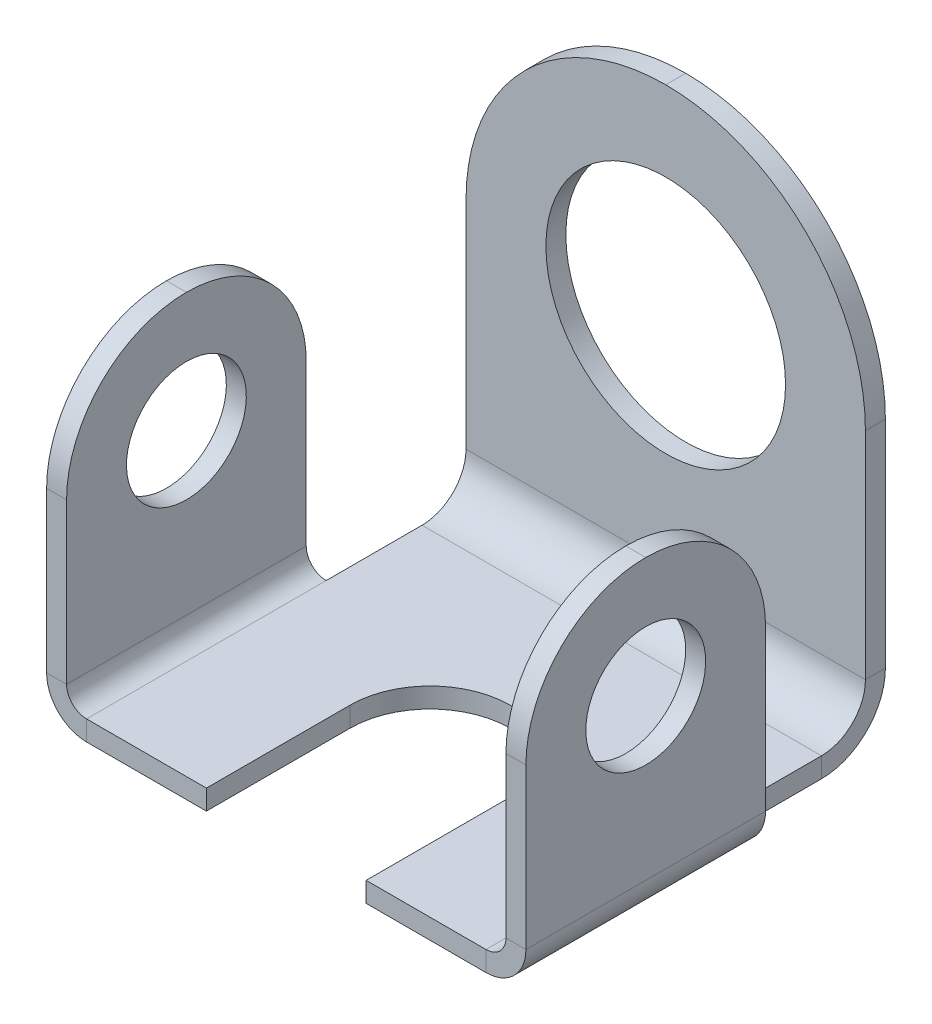
ISO-10303-21;
HEADER;
FILE_DESCRIPTION(('STEP AP214'),'2;1');
FILE_NAME('part.step','',(''),(''),'','','');
FILE_SCHEMA(('AUTOMOTIVE_DESIGN { 1 0 10303 214 1 1 1 1 }'));
ENDSEC;
DATA;
#1=APPLICATION_CONTEXT('core data for automotive mechanical design processes');
#2=APPLICATION_PROTOCOL_DEFINITION('international standard','automotive_design',2000,#1);
#3=PRODUCT_CONTEXT('',#1,'mechanical');
#4=PRODUCT('Part','Part','',(#3));
#5=PRODUCT_RELATED_PRODUCT_CATEGORY('part','',(#4));
#6=PRODUCT_DEFINITION_FORMATION('','',#4);
#7=PRODUCT_DEFINITION_CONTEXT('part definition',#1,'design');
#8=PRODUCT_DEFINITION('design','',#6,#7);
#9=PRODUCT_DEFINITION_SHAPE('','',#8);
#10=(LENGTH_UNIT() NAMED_UNIT(*) SI_UNIT(.MILLI.,.METRE.));
#11=(NAMED_UNIT(*) PLANE_ANGLE_UNIT() SI_UNIT($,.RADIAN.));
#12=(NAMED_UNIT(*) SI_UNIT($,.STERADIAN.) SOLID_ANGLE_UNIT());
#13=UNCERTAINTY_MEASURE_WITH_UNIT(LENGTH_MEASURE(1.E-05),#10,'distance_accuracy_value','');
#14=(GEOMETRIC_REPRESENTATION_CONTEXT(3) GLOBAL_UNCERTAINTY_ASSIGNED_CONTEXT((#13)) GLOBAL_UNIT_ASSIGNED_CONTEXT((#10,
#11,#12)) REPRESENTATION_CONTEXT('',''));
#15=CARTESIAN_POINT('',(0.,0.,0.));
#16=DIRECTION('',(0.,0.,1.));
#17=DIRECTION('',(1.,0.,0.));
#18=AXIS2_PLACEMENT_3D('',#15,#16,#17);
#19=CARTESIAN_POINT('',(0.,2.5,0.));
#20=DIRECTION('',(0.,1.,0.));
#21=DIRECTION('',(0.,0.,1.));
#22=AXIS2_PLACEMENT_3D('',#19,#20,#21);
#23=PLANE('',#22);
#24=DIRECTION('',(1.,0.,0.));
#25=VECTOR('',#24,1.);
#26=CARTESIAN_POINT('',(-25.,2.5,25.));
#27=LINE('',#26,#25);
#28=CARTESIAN_POINT('',(-25.,2.5,25.));
#29=VERTEX_POINT('',#28);
#30=CARTESIAN_POINT('',(-10.,2.5,25.));
#31=VERTEX_POINT('',#30);
#32=EDGE_CURVE('E441',#29,#31,#27,.T.);
#33=ORIENTED_EDGE('',*,*,#32,.T.);
#34=DIRECTION('',(0.,0.,-1.));
#35=VECTOR('',#34,1.);
#36=CARTESIAN_POINT('',(-10.,2.5,43.));
#37=LINE('',#36,#35);
#38=CARTESIAN_POINT('',(-10.,2.5,7.00000000000001));
#39=VERTEX_POINT('',#38);
#40=EDGE_CURVE('E284',#31,#39,#37,.T.);
#41=ORIENTED_EDGE('',*,*,#40,.T.);
#42=CARTESIAN_POINT('',(0.,2.5,7.00000000000001));
#43=DIRECTION('',(0.,1.,0.));
#44=DIRECTION('',(0.,0.,1.));
#45=AXIS2_PLACEMENT_3D('',#42,#43,#44);
#46=CIRCLE('',#45,10.);
#47=CARTESIAN_POINT('',(10.,2.5,7.00000000000001));
#48=VERTEX_POINT('',#47);
#49=EDGE_CURVE('E277',#48,#39,#46,.T.);
#50=ORIENTED_EDGE('',*,*,#49,.F.);
#51=DIRECTION('',(0.,0.,-1.));
#52=VECTOR('',#51,1.);
#53=CARTESIAN_POINT('',(10.,2.5,43.));
#54=LINE('',#53,#52);
#55=CARTESIAN_POINT('',(10.,2.5,25.));
#56=VERTEX_POINT('',#55);
#57=EDGE_CURVE('E287',#56,#48,#54,.T.);
#58=ORIENTED_EDGE('',*,*,#57,.F.);
#59=CARTESIAN_POINT('',(25.,2.5,25.));
#60=VERTEX_POINT('',#59);
#61=EDGE_CURVE('E440',#56,#60,#27,.T.);
#62=ORIENTED_EDGE('',*,*,#61,.T.);
#63=DIRECTION('',(0.,0.,-1.));
#64=VECTOR('',#63,1.);
#65=CARTESIAN_POINT('',(25.,2.5,-25.));
#66=LINE('',#65,#64);
#67=CARTESIAN_POINT('',(25.,2.5,-5.));
#68=VERTEX_POINT('',#67);
#69=EDGE_CURVE('E433',#60,#68,#66,.T.);
#70=ORIENTED_EDGE('',*,*,#69,.T.);
#71=CARTESIAN_POINT('',(25.,2.5,-17.));
#72=VERTEX_POINT('',#71);
#73=EDGE_CURVE('E437',#68,#72,#66,.T.);
#74=ORIENTED_EDGE('',*,*,#73,.T.);
#75=DIRECTION('',(-1.,0.,0.));
#76=VECTOR('',#75,1.);
#77=CARTESIAN_POINT('',(-25.,2.49999999999994,-17.));
#78=LINE('',#77,#76);
#79=CARTESIAN_POINT('',(-25.,2.5,-17.));
#80=VERTEX_POINT('',#79);
#81=EDGE_CURVE('E423',#80,#72,#78,.F.);
#82=ORIENTED_EDGE('',*,*,#81,.F.);
#83=DIRECTION('',(0.,0.,1.));
#84=VECTOR('',#83,1.);
#85=CARTESIAN_POINT('',(-25.,2.5,-25.));
#86=LINE('',#85,#84);
#87=CARTESIAN_POINT('',(-25.,2.5,-5.));
#88=VERTEX_POINT('',#87);
#89=EDGE_CURVE('E436',#80,#88,#86,.T.);
#90=ORIENTED_EDGE('',*,*,#89,.T.);
#91=DIRECTION('',(0.,0.,1.));
#92=VECTOR('',#91,1.);
#93=CARTESIAN_POINT('',(-25.,2.5,25.));
#94=LINE('',#93,#92);
#95=EDGE_CURVE('E346',#29,#88,#94,.F.);
#96=ORIENTED_EDGE('',*,*,#95,.F.);
#97=EDGE_LOOP('',(#33,#41,#50,#58,#62,#70,#74,#82,#90,#96));
#98=FACE_BOUND('',#97,.T.);
#99=ADVANCED_FACE('F103',(#98),#23,.T.);
#100=CARTESIAN_POINT('',(0.,0.,0.));
#101=DIRECTION('',(0.,1.,0.));
#102=DIRECTION('',(0.,0.,1.));
#103=AXIS2_PLACEMENT_3D('',#100,#101,#102);
#104=PLANE('',#103);
#105=DIRECTION('',(0.,0.,-1.));
#106=VECTOR('',#105,1.);
#107=CARTESIAN_POINT('',(-10.,0.,0.));
#108=LINE('',#107,#106);
#109=CARTESIAN_POINT('',(-10.,0.,25.));
#110=VERTEX_POINT('',#109);
#111=CARTESIAN_POINT('',(-10.,0.,7.00000000000001));
#112=VERTEX_POINT('',#111);
#113=EDGE_CURVE('E303',#110,#112,#108,.T.);
#114=ORIENTED_EDGE('',*,*,#113,.F.);
#115=DIRECTION('',(1.,0.,0.));
#116=VECTOR('',#115,1.);
#117=CARTESIAN_POINT('',(-25.,0.,25.));
#118=LINE('',#117,#116);
#119=CARTESIAN_POINT('',(-25.,0.,25.));
#120=VERTEX_POINT('',#119);
#121=EDGE_CURVE('E450',#120,#110,#118,.T.);
#122=ORIENTED_EDGE('',*,*,#121,.F.);
#123=DIRECTION('',(0.,0.,1.));
#124=VECTOR('',#123,1.);
#125=CARTESIAN_POINT('',(-25.,0.,25.));
#126=LINE('',#125,#124);
#127=CARTESIAN_POINT('',(-25.,0.,-5.));
#128=VERTEX_POINT('',#127);
#129=EDGE_CURVE('E333',#120,#128,#126,.F.);
#130=ORIENTED_EDGE('',*,*,#129,.T.);
#131=DIRECTION('',(0.,0.,1.));
#132=VECTOR('',#131,1.);
#133=CARTESIAN_POINT('',(-25.,0.,-25.));
#134=LINE('',#133,#132);
#135=CARTESIAN_POINT('',(-25.,0.,-17.));
#136=VERTEX_POINT('',#135);
#137=EDGE_CURVE('E447',#136,#128,#134,.T.);
#138=ORIENTED_EDGE('',*,*,#137,.F.);
#139=DIRECTION('',(-1.,0.,0.));
#140=VECTOR('',#139,1.);
#141=CARTESIAN_POINT('',(-25.,0.,-17.));
#142=LINE('',#141,#140);
#143=CARTESIAN_POINT('',(25.,0.,-17.));
#144=VERTEX_POINT('',#143);
#145=EDGE_CURVE('E410',#136,#144,#142,.F.);
#146=ORIENTED_EDGE('',*,*,#145,.T.);
#147=DIRECTION('',(0.,0.,-1.));
#148=VECTOR('',#147,1.);
#149=CARTESIAN_POINT('',(25.,0.,-25.));
#150=LINE('',#149,#148);
#151=CARTESIAN_POINT('',(25.,0.,-5.));
#152=VERTEX_POINT('',#151);
#153=EDGE_CURVE('E431',#152,#144,#150,.T.);
#154=ORIENTED_EDGE('',*,*,#153,.F.);
#155=CARTESIAN_POINT('',(25.,0.,25.));
#156=VERTEX_POINT('',#155);
#157=EDGE_CURVE('E444',#156,#152,#150,.T.);
#158=ORIENTED_EDGE('',*,*,#157,.F.);
#159=CARTESIAN_POINT('',(10.,0.,25.));
#160=VERTEX_POINT('',#159);
#161=EDGE_CURVE('E449',#160,#156,#118,.T.);
#162=ORIENTED_EDGE('',*,*,#161,.F.);
#163=DIRECTION('',(0.,0.,-1.));
#164=VECTOR('',#163,1.);
#165=CARTESIAN_POINT('',(10.,0.,0.));
#166=LINE('',#165,#164);
#167=CARTESIAN_POINT('',(10.,0.,7.00000000000001));
#168=VERTEX_POINT('',#167);
#169=EDGE_CURVE('E300',#160,#168,#166,.T.);
#170=ORIENTED_EDGE('',*,*,#169,.T.);
#171=CARTESIAN_POINT('',(0.,0.,7.00000000000001));
#172=DIRECTION('',(0.,1.,0.));
#173=DIRECTION('',(0.,0.,1.));
#174=AXIS2_PLACEMENT_3D('',#171,#172,#173);
#175=CIRCLE('',#174,10.);
#176=EDGE_CURVE('E280',#168,#112,#175,.T.);
#177=ORIENTED_EDGE('',*,*,#176,.T.);
#178=EDGE_LOOP('',(#114,#122,#130,#138,#146,#154,#158,#162,#170,#177));
#179=FACE_BOUND('',#178,.T.);
#180=ADVANCED_FACE('F579',(#179),#104,.F.);
#181=CARTESIAN_POINT('',(-25.,2.5,25.));
#182=DIRECTION('',(0.,0.,-1.));
#183=DIRECTION('',(-1.,0.,0.));
#184=AXIS2_PLACEMENT_3D('',#181,#182,#183);
#185=PLANE('',#184);
#186=DIRECTION('',(0.,-1.,0.));
#187=VECTOR('',#186,1.);
#188=CARTESIAN_POINT('',(-10.,2.5,25.));
#189=LINE('',#188,#187);
#190=EDGE_CURVE('E473',#31,#110,#189,.T.);
#191=ORIENTED_EDGE('',*,*,#190,.F.);
#192=ORIENTED_EDGE('',*,*,#32,.F.);
#193=DIRECTION('',(0.,-1.,0.));
#194=VECTOR('',#193,1.);
#195=CARTESIAN_POINT('',(-25.,2.5,25.));
#196=LINE('',#195,#194);
#197=EDGE_CURVE('E455',#29,#120,#196,.T.);
#198=ORIENTED_EDGE('',*,*,#197,.T.);
#199=ORIENTED_EDGE('',*,*,#121,.T.);
#200=EDGE_LOOP('',(#191,#192,#198,#199));
#201=FACE_BOUND('',#200,.T.);
#202=ADVANCED_FACE('F584',(#201),#185,.F.);
#203=CARTESIAN_POINT('',(-25.,2.5,-25.));
#204=DIRECTION('',(1.,0.,0.));
#205=DIRECTION('',(0.,0.,-1.));
#206=AXIS2_PLACEMENT_3D('',#203,#204,#205);
#207=PLANE('',#206);
#208=DIRECTION('',(0.,-1.,0.));
#209=VECTOR('',#208,1.);
#210=CARTESIAN_POINT('',(-25.,2.5,-5.));
#211=LINE('',#210,#209);
#212=EDGE_CURVE('E340',#88,#128,#211,.T.);
#213=ORIENTED_EDGE('',*,*,#212,.F.);
#214=ORIENTED_EDGE('',*,*,#89,.F.);
#215=DIRECTION('',(0.,-1.,0.));
#216=VECTOR('',#215,1.);
#217=CARTESIAN_POINT('',(-25.,2.49999999999994,-17.));
#218=LINE('',#217,#216);
#219=EDGE_CURVE('E417',#80,#136,#218,.T.);
#220=ORIENTED_EDGE('',*,*,#219,.T.);
#221=ORIENTED_EDGE('',*,*,#137,.T.);
#222=EDGE_LOOP('',(#213,#214,#220,#221));
#223=FACE_BOUND('',#222,.T.);
#224=ADVANCED_FACE('F563',(#223),#207,.F.);
#225=CARTESIAN_POINT('',(25.,2.5,-25.));
#226=DIRECTION('',(-1.,0.,0.));
#227=DIRECTION('',(0.,0.,1.));
#228=AXIS2_PLACEMENT_3D('',#225,#226,#227);
#229=PLANE('',#228);
#230=ORIENTED_EDGE('',*,*,#73,.F.);
#231=DIRECTION('',(0.,-1.,0.));
#232=VECTOR('',#231,1.);
#233=CARTESIAN_POINT('',(25.,2.5,-5.));
#234=LINE('',#233,#232);
#235=EDGE_CURVE('E376',#68,#152,#234,.T.);
#236=ORIENTED_EDGE('',*,*,#235,.T.);
#237=ORIENTED_EDGE('',*,*,#153,.T.);
#238=DIRECTION('',(0.,-1.,0.));
#239=VECTOR('',#238,1.);
#240=CARTESIAN_POINT('',(25.,2.49999999999994,-17.));
#241=LINE('',#240,#239);
#242=EDGE_CURVE('E428',#72,#144,#241,.T.);
#243=ORIENTED_EDGE('',*,*,#242,.F.);
#244=EDGE_LOOP('',(#230,#236,#237,#243));
#245=FACE_BOUND('',#244,.T.);
#246=ADVANCED_FACE('F595',(#245),#229,.F.);
#247=ORIENTED_EDGE('',*,*,#61,.F.);
#248=DIRECTION('',(0.,-1.,0.));
#249=VECTOR('',#248,1.);
#250=CARTESIAN_POINT('',(10.,2.5,25.));
#251=LINE('',#250,#249);
#252=EDGE_CURVE('E290',#56,#160,#251,.T.);
#253=ORIENTED_EDGE('',*,*,#252,.T.);
#254=ORIENTED_EDGE('',*,*,#161,.T.);
#255=DIRECTION('',(0.,-1.,0.));
#256=VECTOR('',#255,1.);
#257=CARTESIAN_POINT('',(25.,2.5,25.));
#258=LINE('',#257,#256);
#259=EDGE_CURVE('E443',#60,#156,#258,.T.);
#260=ORIENTED_EDGE('',*,*,#259,.F.);
#261=EDGE_LOOP('',(#247,#253,#254,#260));
#262=FACE_BOUND('',#261,.T.);
#263=ADVANCED_FACE('F591',(#262),#185,.F.);
#264=CARTESIAN_POINT('',(25.,7.99999999999994,-17.));
#265=DIRECTION('',(1.,0.,0.));
#266=DIRECTION('',(0.,0.,-1.));
#267=AXIS2_PLACEMENT_3D('',#264,#265,#266);
#268=PLANE('',#267);
#269=DIRECTION('',(0.,0.,-1.));
#270=VECTOR('',#269,1.);
#271=CARTESIAN_POINT('',(25.,8.,-25.0000000000004));
#272=LINE('',#271,#270);
#273=CARTESIAN_POINT('',(25.,7.99999999999994,-22.5));
#274=VERTEX_POINT('',#273);
#275=CARTESIAN_POINT('',(25.,7.99999999999994,-25.));
#276=VERTEX_POINT('',#275);
#277=EDGE_CURVE('E407',#274,#276,#272,.T.);
#278=ORIENTED_EDGE('',*,*,#277,.F.);
#279=CARTESIAN_POINT('',(25.,7.99999999999994,-17.));
#280=DIRECTION('',(-1.,0.,0.));
#281=DIRECTION('',(0.,0.,1.));
#282=AXIS2_PLACEMENT_3D('',#279,#280,#281);
#283=CIRCLE('',#282,5.5);
#284=EDGE_CURVE('E420',#72,#274,#283,.F.);
#285=ORIENTED_EDGE('',*,*,#284,.F.);
#286=ORIENTED_EDGE('',*,*,#242,.T.);
#287=CARTESIAN_POINT('',(25.,7.99999999999994,-17.));
#288=DIRECTION('',(-1.,0.,0.));
#289=DIRECTION('',(0.,0.,1.));
#290=AXIS2_PLACEMENT_3D('',#287,#288,#289);
#291=CIRCLE('',#290,8.);
#292=EDGE_CURVE('E413',#144,#276,#291,.F.);
#293=ORIENTED_EDGE('',*,*,#292,.T.);
#294=EDGE_LOOP('',(#278,#285,#286,#293));
#295=FACE_BOUND('',#294,.T.);
#296=ADVANCED_FACE('F594',(#295),#268,.T.);
#297=CARTESIAN_POINT('',(-25.,7.99999999999994,-17.));
#298=DIRECTION('',(1.,0.,0.));
#299=DIRECTION('',(0.,0.,-1.));
#300=AXIS2_PLACEMENT_3D('',#297,#298,#299);
#301=PLANE('',#300);
#302=CARTESIAN_POINT('',(-25.,7.99999999999994,-17.));
#303=DIRECTION('',(-1.,0.,0.));
#304=DIRECTION('',(0.,0.,1.));
#305=AXIS2_PLACEMENT_3D('',#302,#303,#304);
#306=CIRCLE('',#305,5.5);
#307=CARTESIAN_POINT('',(-25.,7.99999999999994,-22.5));
#308=VERTEX_POINT('',#307);
#309=EDGE_CURVE('E389',#308,#80,#306,.T.);
#310=ORIENTED_EDGE('',*,*,#309,.F.);
#311=DIRECTION('',(0.,0.,-1.));
#312=VECTOR('',#311,1.);
#313=CARTESIAN_POINT('',(-25.,7.99999999999998,-22.5));
#314=LINE('',#313,#312);
#315=CARTESIAN_POINT('',(-25.,8.,-25.));
#316=VERTEX_POINT('',#315);
#317=EDGE_CURVE('E401',#308,#316,#314,.T.);
#318=ORIENTED_EDGE('',*,*,#317,.T.);
#319=CARTESIAN_POINT('',(-25.,7.99999999999994,-17.));
#320=DIRECTION('',(-1.,0.,0.));
#321=DIRECTION('',(0.,0.,1.));
#322=AXIS2_PLACEMENT_3D('',#319,#320,#321);
#323=CIRCLE('',#322,8.);
#324=EDGE_CURVE('E414',#316,#136,#323,.T.);
#325=ORIENTED_EDGE('',*,*,#324,.T.);
#326=ORIENTED_EDGE('',*,*,#219,.F.);
#327=EDGE_LOOP('',(#310,#318,#325,#326));
#328=FACE_BOUND('',#327,.T.);
#329=ADVANCED_FACE('F588',(#328),#301,.F.);
#330=CARTESIAN_POINT('',(-25.,7.99999999999994,-17.));
#331=DIRECTION('',(-1.,0.,0.));
#332=DIRECTION('',(0.,0.,-1.));
#333=AXIS2_PLACEMENT_3D('',#330,#331,#332);
#334=CYLINDRICAL_SURFACE('',#333,8.);
#335=ORIENTED_EDGE('',*,*,#145,.F.);
#336=ORIENTED_EDGE('',*,*,#324,.F.);
#337=DIRECTION('',(-1.,0.,0.));
#338=VECTOR('',#337,1.);
#339=CARTESIAN_POINT('',(0.,8.,-25.));
#340=LINE('',#339,#338);
#341=EDGE_CURVE('E398',#276,#316,#340,.T.);
#342=ORIENTED_EDGE('',*,*,#341,.F.);
#343=ORIENTED_EDGE('',*,*,#292,.F.);
#344=EDGE_LOOP('',(#335,#336,#342,#343));
#345=FACE_BOUND('',#344,.T.);
#346=ADVANCED_FACE('F663',(#345),#334,.T.);
#347=CARTESIAN_POINT('',(-25.,7.99999999999994,-17.));
#348=DIRECTION('',(-1.,0.,0.));
#349=DIRECTION('',(0.,0.,-1.));
#350=AXIS2_PLACEMENT_3D('',#347,#348,#349);
#351=CYLINDRICAL_SURFACE('',#350,5.5);
#352=ORIENTED_EDGE('',*,*,#81,.T.);
#353=ORIENTED_EDGE('',*,*,#284,.T.);
#354=DIRECTION('',(1.,0.,0.));
#355=VECTOR('',#354,1.);
#356=CARTESIAN_POINT('',(25.,7.99999999999998,-22.5));
#357=LINE('',#356,#355);
#358=EDGE_CURVE('E404',#274,#308,#357,.F.);
#359=ORIENTED_EDGE('',*,*,#358,.T.);
#360=ORIENTED_EDGE('',*,*,#309,.T.);
#361=EDGE_LOOP('',(#352,#353,#359,#360));
#362=FACE_BOUND('',#361,.T.);
#363=ADVANCED_FACE('F681',(#362),#351,.F.);
#364=CARTESIAN_POINT('',(-25.,2.5,-25.));
#365=DIRECTION('',(-1.,0.,0.));
#366=DIRECTION('',(0.,0.,1.));
#367=AXIS2_PLACEMENT_3D('',#364,#365,#366);
#368=PLANE('',#367);
#369=DIRECTION('',(0.,1.,0.));
#370=VECTOR('',#369,1.);
#371=CARTESIAN_POINT('',(-25.,0.,-22.5));
#372=LINE('',#371,#370);
#373=CARTESIAN_POINT('',(-25.,35.,-22.5));
#374=VERTEX_POINT('',#373);
#375=EDGE_CURVE('E393',#374,#308,#372,.F.);
#376=ORIENTED_EDGE('',*,*,#375,.F.);
#377=DIRECTION('',(0.,0.,1.));
#378=VECTOR('',#377,1.);
#379=CARTESIAN_POINT('',(-25.,35.,-25.));
#380=LINE('',#379,#378);
#381=CARTESIAN_POINT('',(-25.,35.,-25.));
#382=VERTEX_POINT('',#381);
#383=EDGE_CURVE('E461',#374,#382,#380,.F.);
#384=ORIENTED_EDGE('',*,*,#383,.T.);
#385=DIRECTION('',(0.,-1.,0.));
#386=VECTOR('',#385,1.);
#387=CARTESIAN_POINT('',(-25.,2.5,-25.));
#388=LINE('',#387,#386);
#389=EDGE_CURVE('E387',#382,#316,#388,.T.);
#390=ORIENTED_EDGE('',*,*,#389,.T.);
#391=ORIENTED_EDGE('',*,*,#317,.F.);
#392=EDGE_LOOP('',(#376,#384,#390,#391));
#393=FACE_BOUND('',#392,.T.);
#394=ADVANCED_FACE('F685',(#393),#368,.T.);
#395=CARTESIAN_POINT('',(25.,60.,-25.));
#396=DIRECTION('',(1.,0.,0.));
#397=DIRECTION('',(0.,1.,0.));
#398=AXIS2_PLACEMENT_3D('',#395,#396,#397);
#399=PLANE('',#398);
#400=DIRECTION('',(0.,1.,0.));
#401=VECTOR('',#400,1.);
#402=CARTESIAN_POINT('',(25.,60.,-25.));
#403=LINE('',#402,#401);
#404=CARTESIAN_POINT('',(25.,35.,-25.));
#405=VERTEX_POINT('',#404);
#406=EDGE_CURVE('E390',#276,#405,#403,.T.);
#407=ORIENTED_EDGE('',*,*,#406,.T.);
#408=DIRECTION('',(0.,0.,1.));
#409=VECTOR('',#408,1.);
#410=CARTESIAN_POINT('',(25.,35.,-25.));
#411=LINE('',#410,#409);
#412=CARTESIAN_POINT('',(25.,35.,-22.5));
#413=VERTEX_POINT('',#412);
#414=EDGE_CURVE('E468',#405,#413,#411,.T.);
#415=ORIENTED_EDGE('',*,*,#414,.T.);
#416=DIRECTION('',(0.,-1.,0.));
#417=VECTOR('',#416,1.);
#418=CARTESIAN_POINT('',(25.,0.,-22.5));
#419=LINE('',#418,#417);
#420=EDGE_CURVE('E395',#274,#413,#419,.F.);
#421=ORIENTED_EDGE('',*,*,#420,.F.);
#422=ORIENTED_EDGE('',*,*,#277,.T.);
#423=EDGE_LOOP('',(#407,#415,#421,#422));
#424=FACE_BOUND('',#423,.T.);
#425=ADVANCED_FACE('F671',(#424),#399,.T.);
#426=CARTESIAN_POINT('',(0.,0.,-25.));
#427=DIRECTION('',(0.,0.,-1.));
#428=DIRECTION('',(-1.,0.,0.));
#429=AXIS2_PLACEMENT_3D('',#426,#427,#428);
#430=PLANE('',#429);
#431=CARTESIAN_POINT('',(0.,35.,-25.));
#432=DIRECTION('',(0.,0.,-1.));
#433=DIRECTION('',(-1.,0.,0.));
#434=AXIS2_PLACEMENT_3D('',#431,#432,#433);
#435=CIRCLE('',#434,15.);
#436=CARTESIAN_POINT('',(-15.,35.,-25.));
#437=VERTEX_POINT('',#436);
#438=EDGE_CURVE('E308',#437,#437,#435,.T.);
#439=ORIENTED_EDGE('',*,*,#438,.F.);
#440=EDGE_LOOP('',(#439));
#441=FACE_BOUND('',#440,.T.);
#442=ORIENTED_EDGE('',*,*,#389,.F.);
#443=CARTESIAN_POINT('',(0.,35.,-25.));
#444=DIRECTION('',(0.,0.,-1.));
#445=DIRECTION('',(-1.,0.,0.));
#446=AXIS2_PLACEMENT_3D('',#443,#444,#445);
#447=CIRCLE('',#446,25.);
#448=CARTESIAN_POINT('',(0.,60.,-25.));
#449=VERTEX_POINT('',#448);
#450=EDGE_CURVE('E466',#382,#449,#447,.T.);
#451=ORIENTED_EDGE('',*,*,#450,.T.);
#452=CARTESIAN_POINT('',(0.,35.,-25.));
#453=DIRECTION('',(0.,0.,-1.));
#454=DIRECTION('',(-1.,0.,0.));
#455=AXIS2_PLACEMENT_3D('',#452,#453,#454);
#456=CIRCLE('',#455,25.);
#457=EDGE_CURVE('E464',#449,#405,#456,.T.);
#458=ORIENTED_EDGE('',*,*,#457,.T.);
#459=ORIENTED_EDGE('',*,*,#406,.F.);
#460=ORIENTED_EDGE('',*,*,#341,.T.);
#461=EDGE_LOOP('',(#442,#451,#458,#459,#460));
#462=FACE_BOUND('',#461,.T.);
#463=ADVANCED_FACE('F667',(#441,#462),#430,.T.);
#464=CARTESIAN_POINT('',(0.,0.,-22.5));
#465=DIRECTION('',(0.,0.,-1.));
#466=DIRECTION('',(-1.,0.,0.));
#467=AXIS2_PLACEMENT_3D('',#464,#465,#466);
#468=PLANE('',#467);
#469=CARTESIAN_POINT('',(0.,35.,-22.5));
#470=DIRECTION('',(0.,0.,1.));
#471=DIRECTION('',(1.,0.,0.));
#472=AXIS2_PLACEMENT_3D('',#469,#470,#471);
#473=CIRCLE('',#472,15.);
#474=CARTESIAN_POINT('',(15.,35.,-22.5));
#475=VERTEX_POINT('',#474);
#476=EDGE_CURVE('E305',#475,#475,#473,.T.);
#477=ORIENTED_EDGE('',*,*,#476,.F.);
#478=EDGE_LOOP('',(#477));
#479=FACE_BOUND('',#478,.T.);
#480=CARTESIAN_POINT('',(0.,35.,-22.5));
#481=DIRECTION('',(0.,0.,-1.));
#482=DIRECTION('',(-1.,0.,0.));
#483=AXIS2_PLACEMENT_3D('',#480,#481,#482);
#484=CIRCLE('',#483,25.);
#485=CARTESIAN_POINT('',(0.,60.,-22.5));
#486=VERTEX_POINT('',#485);
#487=EDGE_CURVE('E457',#413,#486,#484,.F.);
#488=ORIENTED_EDGE('',*,*,#487,.T.);
#489=CARTESIAN_POINT('',(0.,35.,-22.5));
#490=DIRECTION('',(0.,0.,-1.));
#491=DIRECTION('',(-1.,0.,0.));
#492=AXIS2_PLACEMENT_3D('',#489,#490,#491);
#493=CIRCLE('',#492,25.);
#494=EDGE_CURVE('E459',#486,#374,#493,.F.);
#495=ORIENTED_EDGE('',*,*,#494,.T.);
#496=ORIENTED_EDGE('',*,*,#375,.T.);
#497=ORIENTED_EDGE('',*,*,#358,.F.);
#498=ORIENTED_EDGE('',*,*,#420,.T.);
#499=EDGE_LOOP('',(#488,#495,#496,#497,#498));
#500=FACE_BOUND('',#499,.T.);
#501=ADVANCED_FACE('F610',(#479,#500),#468,.F.);
#502=CARTESIAN_POINT('',(0.,35.,-25.));
#503=DIRECTION('',(0.,0.,1.));
#504=DIRECTION('',(1.,0.,0.));
#505=AXIS2_PLACEMENT_3D('',#502,#503,#504);
#506=CYLINDRICAL_SURFACE('',#505,25.);
#507=ORIENTED_EDGE('',*,*,#414,.F.);
#508=ORIENTED_EDGE('',*,*,#457,.F.);
#509=DIRECTION('',(0.,0.,1.));
#510=VECTOR('',#509,1.);
#511=CARTESIAN_POINT('',(0.,60.,-25.));
#512=LINE('',#511,#510);
#513=EDGE_CURVE('E386',#486,#449,#512,.F.);
#514=ORIENTED_EDGE('',*,*,#513,.F.);
#515=ORIENTED_EDGE('',*,*,#487,.F.);
#516=EDGE_LOOP('',(#507,#508,#514,#515));
#517=FACE_BOUND('',#516,.T.);
#518=ADVANCED_FACE('F606',(#517),#506,.T.);
#519=CARTESIAN_POINT('',(0.,35.,-25.));
#520=DIRECTION('',(0.,0.,1.));
#521=DIRECTION('',(1.,0.,0.));
#522=AXIS2_PLACEMENT_3D('',#519,#520,#521);
#523=CYLINDRICAL_SURFACE('',#522,25.);
#524=ORIENTED_EDGE('',*,*,#450,.F.);
#525=ORIENTED_EDGE('',*,*,#383,.F.);
#526=ORIENTED_EDGE('',*,*,#494,.F.);
#527=ORIENTED_EDGE('',*,*,#513,.T.);
#528=EDGE_LOOP('',(#524,#525,#526,#527));
#529=FACE_BOUND('',#528,.T.);
#530=ADVANCED_FACE('F602',(#529),#523,.T.);
#531=CARTESIAN_POINT('',(25.,5.,25.));
#532=DIRECTION('',(0.,0.,1.));
#533=DIRECTION('',(1.,0.,0.));
#534=AXIS2_PLACEMENT_3D('',#531,#532,#533);
#535=PLANE('',#534);
#536=DIRECTION('',(-1.,0.,0.));
#537=VECTOR('',#536,1.);
#538=CARTESIAN_POINT('',(30.,4.99999999999998,25.));
#539=LINE('',#538,#537);
#540=CARTESIAN_POINT('',(27.5,4.99999999999999,25.));
#541=VERTEX_POINT('',#540);
#542=CARTESIAN_POINT('',(30.,4.99999999999998,25.));
#543=VERTEX_POINT('',#542);
#544=EDGE_CURVE('E353',#541,#543,#539,.F.);
#545=ORIENTED_EDGE('',*,*,#544,.F.);
#546=CARTESIAN_POINT('',(25.,5.,25.));
#547=DIRECTION('',(0.,0.,-1.));
#548=DIRECTION('',(-1.,0.,0.));
#549=AXIS2_PLACEMENT_3D('',#546,#547,#548);
#550=CIRCLE('',#549,2.5);
#551=EDGE_CURVE('E379',#60,#541,#550,.F.);
#552=ORIENTED_EDGE('',*,*,#551,.F.);
#553=ORIENTED_EDGE('',*,*,#259,.T.);
#554=CARTESIAN_POINT('',(25.,5.,25.));
#555=DIRECTION('',(0.,0.,-1.));
#556=DIRECTION('',(-1.,0.,0.));
#557=AXIS2_PLACEMENT_3D('',#554,#555,#556);
#558=CIRCLE('',#557,5.);
#559=EDGE_CURVE('E373',#156,#543,#558,.F.);
#560=ORIENTED_EDGE('',*,*,#559,.T.);
#561=EDGE_LOOP('',(#545,#552,#553,#560));
#562=FACE_BOUND('',#561,.T.);
#563=ADVANCED_FACE('F605',(#562),#535,.T.);
#564=CARTESIAN_POINT('',(25.,5.,-5.));
#565=DIRECTION('',(0.,0.,1.));
#566=DIRECTION('',(1.,0.,0.));
#567=AXIS2_PLACEMENT_3D('',#564,#565,#566);
#568=PLANE('',#567);
#569=CARTESIAN_POINT('',(25.,5.,-5.));
#570=DIRECTION('',(0.,0.,-1.));
#571=DIRECTION('',(-1.,0.,0.));
#572=AXIS2_PLACEMENT_3D('',#569,#570,#571);
#573=CIRCLE('',#572,2.5);
#574=CARTESIAN_POINT('',(27.5,4.99999999999999,-5.));
#575=VERTEX_POINT('',#574);
#576=EDGE_CURVE('E356',#575,#68,#573,.T.);
#577=ORIENTED_EDGE('',*,*,#576,.F.);
#578=DIRECTION('',(-1.,0.,0.));
#579=VECTOR('',#578,1.);
#580=CARTESIAN_POINT('',(27.5,4.99999999999999,-5.));
#581=LINE('',#580,#579);
#582=CARTESIAN_POINT('',(30.,4.99999999999999,-5.));
#583=VERTEX_POINT('',#582);
#584=EDGE_CURVE('E366',#575,#583,#581,.F.);
#585=ORIENTED_EDGE('',*,*,#584,.T.);
#586=CARTESIAN_POINT('',(25.,5.,-5.));
#587=DIRECTION('',(0.,0.,-1.));
#588=DIRECTION('',(-1.,0.,0.));
#589=AXIS2_PLACEMENT_3D('',#586,#587,#588);
#590=CIRCLE('',#589,5.);
#591=EDGE_CURVE('E377',#583,#152,#590,.T.);
#592=ORIENTED_EDGE('',*,*,#591,.T.);
#593=ORIENTED_EDGE('',*,*,#235,.F.);
#594=EDGE_LOOP('',(#577,#585,#592,#593));
#595=FACE_BOUND('',#594,.T.);
#596=ADVANCED_FACE('F648',(#595),#568,.F.);
#597=CARTESIAN_POINT('',(25.,5.,-5.));
#598=DIRECTION('',(0.,0.,-1.));
#599=DIRECTION('',(1.,0.,0.));
#600=AXIS2_PLACEMENT_3D('',#597,#598,#599);
#601=CYLINDRICAL_SURFACE('',#600,5.);
#602=ORIENTED_EDGE('',*,*,#157,.T.);
#603=ORIENTED_EDGE('',*,*,#591,.F.);
#604=DIRECTION('',(0.,0.,-1.));
#605=VECTOR('',#604,1.);
#606=CARTESIAN_POINT('',(30.,4.99999999999998,25.));
#607=LINE('',#606,#605);
#608=EDGE_CURVE('E363',#583,#543,#607,.F.);
#609=ORIENTED_EDGE('',*,*,#608,.T.);
#610=ORIENTED_EDGE('',*,*,#559,.F.);
#611=EDGE_LOOP('',(#602,#603,#609,#610));
#612=FACE_BOUND('',#611,.T.);
#613=ADVANCED_FACE('F650',(#612),#601,.T.);
#614=CARTESIAN_POINT('',(25.,5.,-5.));
#615=DIRECTION('',(0.,0.,-1.));
#616=DIRECTION('',(1.,0.,0.));
#617=AXIS2_PLACEMENT_3D('',#614,#615,#616);
#618=CYLINDRICAL_SURFACE('',#617,2.5);
#619=ORIENTED_EDGE('',*,*,#69,.F.);
#620=ORIENTED_EDGE('',*,*,#551,.T.);
#621=DIRECTION('',(0.,0.,-1.));
#622=VECTOR('',#621,1.);
#623=CARTESIAN_POINT('',(27.5,4.99999999999999,25.));
#624=LINE('',#623,#622);
#625=EDGE_CURVE('E369',#541,#575,#624,.T.);
#626=ORIENTED_EDGE('',*,*,#625,.T.);
#627=ORIENTED_EDGE('',*,*,#576,.T.);
#628=EDGE_LOOP('',(#619,#620,#626,#627));
#629=FACE_BOUND('',#628,.T.);
#630=ADVANCED_FACE('F639',(#629),#618,.F.);
#631=CARTESIAN_POINT('',(30.,2.49999999999999,25.));
#632=DIRECTION('',(0.,0.,-1.));
#633=DIRECTION('',(-1.,0.,0.));
#634=AXIS2_PLACEMENT_3D('',#631,#632,#633);
#635=PLANE('',#634);
#636=DIRECTION('',(0.,-1.,0.));
#637=VECTOR('',#636,1.);
#638=CARTESIAN_POINT('',(30.,0.,25.));
#639=LINE('',#638,#637);
#640=CARTESIAN_POINT('',(30.0000000000001,25.,25.));
#641=VERTEX_POINT('',#640);
#642=EDGE_CURVE('E357',#641,#543,#639,.T.);
#643=ORIENTED_EDGE('',*,*,#642,.F.);
#644=DIRECTION('',(-1.,0.,0.));
#645=VECTOR('',#644,1.);
#646=CARTESIAN_POINT('',(30.0000000000001,25.,25.));
#647=LINE('',#646,#645);
#648=CARTESIAN_POINT('',(27.5000000000001,25.,25.));
#649=VERTEX_POINT('',#648);
#650=EDGE_CURVE('E489',#641,#649,#647,.T.);
#651=ORIENTED_EDGE('',*,*,#650,.T.);
#652=DIRECTION('',(0.,1.,0.));
#653=VECTOR('',#652,1.);
#654=CARTESIAN_POINT('',(27.5,2.5,25.));
#655=LINE('',#654,#653);
#656=EDGE_CURVE('E361',#649,#541,#655,.F.);
#657=ORIENTED_EDGE('',*,*,#656,.T.);
#658=ORIENTED_EDGE('',*,*,#544,.T.);
#659=EDGE_LOOP('',(#643,#651,#657,#658));
#660=FACE_BOUND('',#659,.T.);
#661=ADVANCED_FACE('F629',(#660),#635,.F.);
#662=CARTESIAN_POINT('',(30.0000000000001,40.,-4.99999999999999));
#663=DIRECTION('',(0.,0.,1.));
#664=DIRECTION('',(1.,0.,0.));
#665=AXIS2_PLACEMENT_3D('',#662,#663,#664);
#666=PLANE('',#665);
#667=DIRECTION('',(0.,-1.,0.));
#668=VECTOR('',#667,1.);
#669=CARTESIAN_POINT('',(27.5000000000001,40.,-4.99999999999999));
#670=LINE('',#669,#668);
#671=CARTESIAN_POINT('',(27.5000000000001,25.,-5.));
#672=VERTEX_POINT('',#671);
#673=EDGE_CURVE('E359',#575,#672,#670,.F.);
#674=ORIENTED_EDGE('',*,*,#673,.T.);
#675=DIRECTION('',(-1.,0.,0.));
#676=VECTOR('',#675,1.);
#677=CARTESIAN_POINT('',(30.0000000000001,25.,-5.));
#678=LINE('',#677,#676);
#679=CARTESIAN_POINT('',(30.0000000000001,25.,-4.99999999999999));
#680=VERTEX_POINT('',#679);
#681=EDGE_CURVE('E13',#672,#680,#678,.F.);
#682=ORIENTED_EDGE('',*,*,#681,.T.);
#683=DIRECTION('',(0.,1.,0.));
#684=VECTOR('',#683,1.);
#685=CARTESIAN_POINT('',(30.,0.,-5.));
#686=LINE('',#685,#684);
#687=EDGE_CURVE('E354',#583,#680,#686,.T.);
#688=ORIENTED_EDGE('',*,*,#687,.F.);
#689=ORIENTED_EDGE('',*,*,#584,.F.);
#690=EDGE_LOOP('',(#674,#682,#688,#689));
#691=FACE_BOUND('',#690,.T.);
#692=ADVANCED_FACE('F646',(#691),#666,.F.);
#693=CARTESIAN_POINT('',(30.,0.,0.));
#694=DIRECTION('',(-1.,0.,0.));
#695=DIRECTION('',(0.,-1.,0.));
#696=AXIS2_PLACEMENT_3D('',#693,#694,#695);
#697=PLANE('',#696);
#698=CARTESIAN_POINT('',(30.0000000000001,25.,10.));
#699=DIRECTION('',(1.,0.,0.));
#700=DIRECTION('',(0.,1.,0.));
#701=AXIS2_PLACEMENT_3D('',#698,#699,#700);
#702=CIRCLE('',#701,7.5);
#703=CARTESIAN_POINT('',(30.0000000000001,32.5,10.));
#704=VERTEX_POINT('',#703);
#705=EDGE_CURVE('E511',#704,#704,#702,.T.);
#706=ORIENTED_EDGE('',*,*,#705,.F.);
#707=EDGE_LOOP('',(#706));
#708=FACE_BOUND('',#707,.T.);
#709=CARTESIAN_POINT('',(30.0000000000001,25.,10.));
#710=DIRECTION('',(-1.,0.,0.));
#711=DIRECTION('',(0.,-1.,0.));
#712=AXIS2_PLACEMENT_3D('',#709,#710,#711);
#713=CIRCLE('',#712,15.);
#714=CARTESIAN_POINT('',(30.0000000000001,40.,10.));
#715=VERTEX_POINT('',#714);
#716=EDGE_CURVE('E120',#680,#715,#713,.F.);
#717=ORIENTED_EDGE('',*,*,#716,.T.);
#718=CARTESIAN_POINT('',(30.0000000000001,25.,10.));
#719=DIRECTION('',(-1.,0.,0.));
#720=DIRECTION('',(0.,-1.,0.));
#721=AXIS2_PLACEMENT_3D('',#718,#719,#720);
#722=CIRCLE('',#721,15.);
#723=EDGE_CURVE('E112',#715,#641,#722,.F.);
#724=ORIENTED_EDGE('',*,*,#723,.T.);
#725=ORIENTED_EDGE('',*,*,#642,.T.);
#726=ORIENTED_EDGE('',*,*,#608,.F.);
#727=ORIENTED_EDGE('',*,*,#687,.T.);
#728=EDGE_LOOP('',(#717,#724,#725,#726,#727));
#729=FACE_BOUND('',#728,.T.);
#730=ADVANCED_FACE('F626',(#708,#729),#697,.F.);
#731=CARTESIAN_POINT('',(27.5,0.,0.));
#732=DIRECTION('',(-1.,0.,0.));
#733=DIRECTION('',(0.,-1.,0.));
#734=AXIS2_PLACEMENT_3D('',#731,#732,#733);
#735=PLANE('',#734);
#736=CARTESIAN_POINT('',(27.5000000000001,25.,10.));
#737=DIRECTION('',(-1.,0.,0.));
#738=DIRECTION('',(0.,-1.,0.));
#739=AXIS2_PLACEMENT_3D('',#736,#737,#738);
#740=CIRCLE('',#739,7.5);
#741=CARTESIAN_POINT('',(27.5,17.5,10.));
#742=VERTEX_POINT('',#741);
#743=EDGE_CURVE('E501',#742,#742,#740,.T.);
#744=ORIENTED_EDGE('',*,*,#743,.F.);
#745=EDGE_LOOP('',(#744));
#746=FACE_BOUND('',#745,.T.);
#747=ORIENTED_EDGE('',*,*,#656,.F.);
#748=CARTESIAN_POINT('',(27.5000000000001,25.,10.));
#749=DIRECTION('',(-1.,0.,0.));
#750=DIRECTION('',(0.,-1.,0.));
#751=AXIS2_PLACEMENT_3D('',#748,#749,#750);
#752=CIRCLE('',#751,15.);
#753=CARTESIAN_POINT('',(27.5000000000001,40.,10.));
#754=VERTEX_POINT('',#753);
#755=EDGE_CURVE('E494',#649,#754,#752,.T.);
#756=ORIENTED_EDGE('',*,*,#755,.T.);
#757=CARTESIAN_POINT('',(27.5000000000001,25.,10.));
#758=DIRECTION('',(-1.,0.,0.));
#759=DIRECTION('',(0.,-1.,0.));
#760=AXIS2_PLACEMENT_3D('',#757,#758,#759);
#761=CIRCLE('',#760,15.);
#762=EDGE_CURVE('E492',#754,#672,#761,.T.);
#763=ORIENTED_EDGE('',*,*,#762,.T.);
#764=ORIENTED_EDGE('',*,*,#673,.F.);
#765=ORIENTED_EDGE('',*,*,#625,.F.);
#766=EDGE_LOOP('',(#747,#756,#763,#764,#765));
#767=FACE_BOUND('',#766,.T.);
#768=ADVANCED_FACE('F643',(#746,#767),#735,.T.);
#769=CARTESIAN_POINT('',(-25.,5.,-5.));
#770=DIRECTION('',(0.,0.,-1.));
#771=DIRECTION('',(-1.,0.,0.));
#772=AXIS2_PLACEMENT_3D('',#769,#770,#771);
#773=PLANE('',#772);
#774=DIRECTION('',(-1.,0.,0.));
#775=VECTOR('',#774,1.);
#776=CARTESIAN_POINT('',(-30.,4.99999999999998,-5.));
#777=LINE('',#776,#775);
#778=CARTESIAN_POINT('',(-27.5,4.99999999999999,-5.));
#779=VERTEX_POINT('',#778);
#780=CARTESIAN_POINT('',(-30.,4.99999999999998,-5.));
#781=VERTEX_POINT('',#780);
#782=EDGE_CURVE('E311',#779,#781,#777,.T.);
#783=ORIENTED_EDGE('',*,*,#782,.F.);
#784=CARTESIAN_POINT('',(-25.,5.,-5.));
#785=DIRECTION('',(0.,0.,1.));
#786=DIRECTION('',(1.,0.,0.));
#787=AXIS2_PLACEMENT_3D('',#784,#785,#786);
#788=CIRCLE('',#787,2.5);
#789=EDGE_CURVE('E343',#88,#779,#788,.F.);
#790=ORIENTED_EDGE('',*,*,#789,.F.);
#791=ORIENTED_EDGE('',*,*,#212,.T.);
#792=CARTESIAN_POINT('',(-25.,5.,-5.));
#793=DIRECTION('',(0.,0.,1.));
#794=DIRECTION('',(1.,0.,0.));
#795=AXIS2_PLACEMENT_3D('',#792,#793,#794);
#796=CIRCLE('',#795,5.);
#797=EDGE_CURVE('E336',#128,#781,#796,.F.);
#798=ORIENTED_EDGE('',*,*,#797,.T.);
#799=EDGE_LOOP('',(#783,#790,#791,#798));
#800=FACE_BOUND('',#799,.T.);
#801=ADVANCED_FACE('F559',(#800),#773,.T.);
#802=CARTESIAN_POINT('',(-25.,5.,25.));
#803=DIRECTION('',(0.,0.,-1.));
#804=DIRECTION('',(-1.,0.,0.));
#805=AXIS2_PLACEMENT_3D('',#802,#803,#804);
#806=PLANE('',#805);
#807=CARTESIAN_POINT('',(-25.,5.,25.));
#808=DIRECTION('',(0.,0.,1.));
#809=DIRECTION('',(1.,0.,0.));
#810=AXIS2_PLACEMENT_3D('',#807,#808,#809);
#811=CIRCLE('',#810,2.5);
#812=CARTESIAN_POINT('',(-27.5,4.99999999999999,25.));
#813=VERTEX_POINT('',#812);
#814=EDGE_CURVE('E315',#813,#29,#811,.T.);
#815=ORIENTED_EDGE('',*,*,#814,.F.);
#816=DIRECTION('',(-1.,0.,0.));
#817=VECTOR('',#816,1.);
#818=CARTESIAN_POINT('',(-27.5,4.99999999999999,25.));
#819=LINE('',#818,#817);
#820=CARTESIAN_POINT('',(-30.,4.99999999999998,25.));
#821=VERTEX_POINT('',#820);
#822=EDGE_CURVE('E325',#813,#821,#819,.T.);
#823=ORIENTED_EDGE('',*,*,#822,.T.);
#824=CARTESIAN_POINT('',(-25.,5.,25.));
#825=DIRECTION('',(0.,0.,1.));
#826=DIRECTION('',(1.,0.,0.));
#827=AXIS2_PLACEMENT_3D('',#824,#825,#826);
#828=CIRCLE('',#827,5.);
#829=EDGE_CURVE('E337',#821,#120,#828,.T.);
#830=ORIENTED_EDGE('',*,*,#829,.T.);
#831=ORIENTED_EDGE('',*,*,#197,.F.);
#832=EDGE_LOOP('',(#815,#823,#830,#831));
#833=FACE_BOUND('',#832,.T.);
#834=ADVANCED_FACE('F551',(#833),#806,.F.);
#835=CARTESIAN_POINT('',(-25.,5.,25.));
#836=DIRECTION('',(0.,0.,1.));
#837=DIRECTION('',(-1.,0.,0.));
#838=AXIS2_PLACEMENT_3D('',#835,#836,#837);
#839=CYLINDRICAL_SURFACE('',#838,5.);
#840=ORIENTED_EDGE('',*,*,#129,.F.);
#841=ORIENTED_EDGE('',*,*,#829,.F.);
#842=DIRECTION('',(0.,0.,1.));
#843=VECTOR('',#842,1.);
#844=CARTESIAN_POINT('',(-30.,4.99999999999999,-5.));
#845=LINE('',#844,#843);
#846=EDGE_CURVE('E323',#821,#781,#845,.F.);
#847=ORIENTED_EDGE('',*,*,#846,.T.);
#848=ORIENTED_EDGE('',*,*,#797,.F.);
#849=EDGE_LOOP('',(#840,#841,#847,#848));
#850=FACE_BOUND('',#849,.T.);
#851=ADVANCED_FACE('F557',(#850),#839,.T.);
#852=CARTESIAN_POINT('',(-25.,5.,25.));
#853=DIRECTION('',(0.,0.,1.));
#854=DIRECTION('',(-1.,0.,0.));
#855=AXIS2_PLACEMENT_3D('',#852,#853,#854);
#856=CYLINDRICAL_SURFACE('',#855,2.5);
#857=ORIENTED_EDGE('',*,*,#95,.T.);
#858=ORIENTED_EDGE('',*,*,#789,.T.);
#859=DIRECTION('',(0.,0.,1.));
#860=VECTOR('',#859,1.);
#861=CARTESIAN_POINT('',(-27.5,4.99999999999999,-5.));
#862=LINE('',#861,#860);
#863=EDGE_CURVE('E328',#779,#813,#862,.T.);
#864=ORIENTED_EDGE('',*,*,#863,.T.);
#865=ORIENTED_EDGE('',*,*,#814,.T.);
#866=EDGE_LOOP('',(#857,#858,#864,#865));
#867=FACE_BOUND('',#866,.T.);
#868=ADVANCED_FACE('F568',(#867),#856,.F.);
#869=CARTESIAN_POINT('',(-30.,2.49999999999999,25.));
#870=DIRECTION('',(0.,0.,1.));
#871=DIRECTION('',(1.,0.,0.));
#872=AXIS2_PLACEMENT_3D('',#869,#870,#871);
#873=PLANE('',#872);
#874=DIRECTION('',(0.,-1.,0.));
#875=VECTOR('',#874,1.);
#876=CARTESIAN_POINT('',(-27.5,0.,25.));
#877=LINE('',#876,#875);
#878=CARTESIAN_POINT('',(-27.5000000000001,25.,25.));
#879=VERTEX_POINT('',#878);
#880=EDGE_CURVE('E321',#879,#813,#877,.T.);
#881=ORIENTED_EDGE('',*,*,#880,.F.);
#882=DIRECTION('',(1.,0.,0.));
#883=VECTOR('',#882,1.);
#884=CARTESIAN_POINT('',(-30.0000000000001,25.,25.));
#885=LINE('',#884,#883);
#886=CARTESIAN_POINT('',(-30.0000000000001,25.,25.));
#887=VERTEX_POINT('',#886);
#888=EDGE_CURVE('E487',#879,#887,#885,.F.);
#889=ORIENTED_EDGE('',*,*,#888,.T.);
#890=DIRECTION('',(0.,1.,0.));
#891=VECTOR('',#890,1.);
#892=CARTESIAN_POINT('',(-30.,2.49999999999999,25.));
#893=LINE('',#892,#891);
#894=EDGE_CURVE('E316',#887,#821,#893,.F.);
#895=ORIENTED_EDGE('',*,*,#894,.T.);
#896=ORIENTED_EDGE('',*,*,#822,.F.);
#897=EDGE_LOOP('',(#881,#889,#895,#896));
#898=FACE_BOUND('',#897,.T.);
#899=ADVANCED_FACE('F545',(#898),#873,.T.);
#900=CARTESIAN_POINT('',(-30.0000000000001,40.,-4.99999999999999));
#901=DIRECTION('',(0.,0.,-1.));
#902=DIRECTION('',(-1.,0.,0.));
#903=AXIS2_PLACEMENT_3D('',#900,#901,#902);
#904=PLANE('',#903);
#905=DIRECTION('',(0.,-1.,0.));
#906=VECTOR('',#905,1.);
#907=CARTESIAN_POINT('',(-30.0000000000001,40.,-4.99999999999999));
#908=LINE('',#907,#906);
#909=CARTESIAN_POINT('',(-30.0000000000001,25.,-5.));
#910=VERTEX_POINT('',#909);
#911=EDGE_CURVE('E312',#781,#910,#908,.F.);
#912=ORIENTED_EDGE('',*,*,#911,.T.);
#913=DIRECTION('',(1.,0.,0.));
#914=VECTOR('',#913,1.);
#915=CARTESIAN_POINT('',(-30.0000000000001,25.,-5.));
#916=LINE('',#915,#914);
#917=CARTESIAN_POINT('',(-27.5000000000001,25.,-4.99999999999999));
#918=VERTEX_POINT('',#917);
#919=EDGE_CURVE('E476',#910,#918,#916,.T.);
#920=ORIENTED_EDGE('',*,*,#919,.T.);
#921=DIRECTION('',(0.,1.,0.));
#922=VECTOR('',#921,1.);
#923=CARTESIAN_POINT('',(-27.5,0.,-5.));
#924=LINE('',#923,#922);
#925=EDGE_CURVE('E318',#779,#918,#924,.T.);
#926=ORIENTED_EDGE('',*,*,#925,.F.);
#927=ORIENTED_EDGE('',*,*,#782,.T.);
#928=EDGE_LOOP('',(#912,#920,#926,#927));
#929=FACE_BOUND('',#928,.T.);
#930=ADVANCED_FACE('F531',(#929),#904,.T.);
#931=CARTESIAN_POINT('',(-30.,0.,0.));
#932=DIRECTION('',(1.,0.,0.));
#933=DIRECTION('',(0.,-1.,0.));
#934=AXIS2_PLACEMENT_3D('',#931,#932,#933);
#935=PLANE('',#934);
#936=CARTESIAN_POINT('',(-30.0000000000001,25.0000000000002,10.));
#937=DIRECTION('',(1.,0.,0.));
#938=DIRECTION('',(0.,1.,0.));
#939=AXIS2_PLACEMENT_3D('',#936,#937,#938);
#940=CIRCLE('',#939,7.5);
#941=CARTESIAN_POINT('',(-30.0000000000001,32.5000000000002,10.));
#942=VERTEX_POINT('',#941);
#943=EDGE_CURVE('E505',#942,#942,#940,.T.);
#944=ORIENTED_EDGE('',*,*,#943,.T.);
#945=EDGE_LOOP('',(#944));
#946=FACE_BOUND('',#945,.T.);
#947=CARTESIAN_POINT('',(-30.0000000000001,25.,10.));
#948=DIRECTION('',(1.,0.,0.));
#949=DIRECTION('',(0.,1.,0.));
#950=AXIS2_PLACEMENT_3D('',#947,#948,#949);
#951=CIRCLE('',#950,15.);
#952=CARTESIAN_POINT('',(-30.0000000000001,40.,10.));
#953=VERTEX_POINT('',#952);
#954=EDGE_CURVE('E483',#887,#953,#951,.F.);
#955=ORIENTED_EDGE('',*,*,#954,.T.);
#956=CARTESIAN_POINT('',(-30.0000000000001,25.,10.));
#957=DIRECTION('',(1.,0.,0.));
#958=DIRECTION('',(0.,1.,0.));
#959=AXIS2_PLACEMENT_3D('',#956,#957,#958);
#960=CIRCLE('',#959,15.);
#961=EDGE_CURVE('E485',#953,#910,#960,.F.);
#962=ORIENTED_EDGE('',*,*,#961,.T.);
#963=ORIENTED_EDGE('',*,*,#911,.F.);
#964=ORIENTED_EDGE('',*,*,#846,.F.);
#965=ORIENTED_EDGE('',*,*,#894,.F.);
#966=EDGE_LOOP('',(#955,#962,#963,#964,#965));
#967=FACE_BOUND('',#966,.T.);
#968=ADVANCED_FACE('F525',(#946,#967),#935,.F.);
#969=CARTESIAN_POINT('',(-27.5,0.,0.));
#970=DIRECTION('',(1.,0.,0.));
#971=DIRECTION('',(0.,-1.,0.));
#972=AXIS2_PLACEMENT_3D('',#969,#970,#971);
#973=PLANE('',#972);
#974=CARTESIAN_POINT('',(-27.5000000000001,25.0000000000002,10.));
#975=DIRECTION('',(1.,0.,0.));
#976=DIRECTION('',(0.,1.,0.));
#977=AXIS2_PLACEMENT_3D('',#974,#975,#976);
#978=CIRCLE('',#977,7.5);
#979=CARTESIAN_POINT('',(-27.5000000000001,32.5000000000002,10.));
#980=VERTEX_POINT('',#979);
#981=EDGE_CURVE('E107',#980,#980,#978,.T.);
#982=ORIENTED_EDGE('',*,*,#981,.F.);
#983=EDGE_LOOP('',(#982));
#984=FACE_BOUND('',#983,.T.);
#985=ORIENTED_EDGE('',*,*,#925,.T.);
#986=CARTESIAN_POINT('',(-27.5000000000001,25.,10.));
#987=DIRECTION('',(1.,0.,0.));
#988=DIRECTION('',(0.,1.,0.));
#989=AXIS2_PLACEMENT_3D('',#986,#987,#988);
#990=CIRCLE('',#989,15.);
#991=CARTESIAN_POINT('',(-27.5000000000001,40.,10.));
#992=VERTEX_POINT('',#991);
#993=EDGE_CURVE('E481',#918,#992,#990,.T.);
#994=ORIENTED_EDGE('',*,*,#993,.T.);
#995=CARTESIAN_POINT('',(-27.5000000000001,25.,10.));
#996=DIRECTION('',(1.,0.,0.));
#997=DIRECTION('',(0.,1.,0.));
#998=AXIS2_PLACEMENT_3D('',#995,#996,#997);
#999=CIRCLE('',#998,15.);
#1000=EDGE_CURVE('E479',#992,#879,#999,.T.);
#1001=ORIENTED_EDGE('',*,*,#1000,.T.);
#1002=ORIENTED_EDGE('',*,*,#880,.T.);
#1003=ORIENTED_EDGE('',*,*,#863,.F.);
#1004=EDGE_LOOP('',(#985,#994,#1001,#1002,#1003));
#1005=FACE_BOUND('',#1004,.T.);
#1006=ADVANCED_FACE('F521',(#984,#1005),#973,.T.);
#1007=CARTESIAN_POINT('',(0.,35.,-32.5));
#1008=DIRECTION('',(0.,0.,1.));
#1009=DIRECTION('',(1.,0.,0.));
#1010=AXIS2_PLACEMENT_3D('',#1007,#1008,#1009);
#1011=CYLINDRICAL_SURFACE('',#1010,15.);
#1012=ORIENTED_EDGE('',*,*,#438,.T.);
#1013=EDGE_LOOP('',(#1012));
#1014=FACE_BOUND('',#1013,.T.);
#1015=ORIENTED_EDGE('',*,*,#476,.T.);
#1016=EDGE_LOOP('',(#1015));
#1017=FACE_BOUND('',#1016,.T.);
#1018=ADVANCED_FACE('F524',(#1014,#1017),#1011,.F.);
#1019=CARTESIAN_POINT('',(0.,-7.5,7.00000000000001));
#1020=DIRECTION('',(0.,1.,0.));
#1021=DIRECTION('',(0.,0.,1.));
#1022=AXIS2_PLACEMENT_3D('',#1019,#1020,#1021);
#1023=CYLINDRICAL_SURFACE('',#1022,10.);
#1024=DIRECTION('',(0.,1.,0.));
#1025=VECTOR('',#1024,1.);
#1026=CARTESIAN_POINT('',(10.,-7.5,7.00000000000001));
#1027=LINE('',#1026,#1025);
#1028=EDGE_CURVE('E272',#168,#48,#1027,.T.);
#1029=ORIENTED_EDGE('',*,*,#1028,.T.);
#1030=ORIENTED_EDGE('',*,*,#49,.T.);
#1031=DIRECTION('',(0.,1.,0.));
#1032=VECTOR('',#1031,1.);
#1033=CARTESIAN_POINT('',(-10.,-7.5,7.00000000000001));
#1034=LINE('',#1033,#1032);
#1035=EDGE_CURVE('E283',#112,#39,#1034,.T.);
#1036=ORIENTED_EDGE('',*,*,#1035,.F.);
#1037=ORIENTED_EDGE('',*,*,#176,.F.);
#1038=EDGE_LOOP('',(#1029,#1030,#1036,#1037));
#1039=FACE_BOUND('',#1038,.T.);
#1040=ADVANCED_FACE('F274',(#1039),#1023,.F.);
#1041=CARTESIAN_POINT('',(-10.,-7.5,43.));
#1042=DIRECTION('',(1.,0.,0.));
#1043=DIRECTION('',(0.,0.,-1.));
#1044=AXIS2_PLACEMENT_3D('',#1041,#1042,#1043);
#1045=PLANE('',#1044);
#1046=ORIENTED_EDGE('',*,*,#113,.T.);
#1047=ORIENTED_EDGE('',*,*,#1035,.T.);
#1048=ORIENTED_EDGE('',*,*,#40,.F.);
#1049=ORIENTED_EDGE('',*,*,#190,.T.);
#1050=EDGE_LOOP('',(#1046,#1047,#1048,#1049));
#1051=FACE_BOUND('',#1050,.T.);
#1052=ADVANCED_FACE('F892',(#1051),#1045,.T.);
#1053=CARTESIAN_POINT('',(10.,-7.5,43.));
#1054=DIRECTION('',(1.,0.,0.));
#1055=DIRECTION('',(0.,0.,-1.));
#1056=AXIS2_PLACEMENT_3D('',#1053,#1054,#1055);
#1057=PLANE('',#1056);
#1058=ORIENTED_EDGE('',*,*,#252,.F.);
#1059=ORIENTED_EDGE('',*,*,#57,.T.);
#1060=ORIENTED_EDGE('',*,*,#1028,.F.);
#1061=ORIENTED_EDGE('',*,*,#169,.F.);
#1062=EDGE_LOOP('',(#1058,#1059,#1060,#1061));
#1063=FACE_BOUND('',#1062,.T.);
#1064=ADVANCED_FACE('F288',(#1063),#1057,.F.);
#1065=CARTESIAN_POINT('',(-30.0000000000001,25.,10.));
#1066=DIRECTION('',(1.,0.,0.));
#1067=DIRECTION('',(0.,1.,0.));
#1068=AXIS2_PLACEMENT_3D('',#1065,#1066,#1067);
#1069=CYLINDRICAL_SURFACE('',#1068,15.);
#1070=DIRECTION('',(1.,0.,0.));
#1071=VECTOR('',#1070,1.);
#1072=CARTESIAN_POINT('',(-30.0000000000001,40.,10.));
#1073=LINE('',#1072,#1071);
#1074=EDGE_CURVE('E293',#953,#992,#1073,.T.);
#1075=ORIENTED_EDGE('',*,*,#1074,.F.);
#1076=ORIENTED_EDGE('',*,*,#954,.F.);
#1077=ORIENTED_EDGE('',*,*,#888,.F.);
#1078=ORIENTED_EDGE('',*,*,#1000,.F.);
#1079=EDGE_LOOP('',(#1075,#1076,#1077,#1078));
#1080=FACE_BOUND('',#1079,.T.);
#1081=ADVANCED_FACE('F540',(#1080),#1069,.T.);
#1082=CARTESIAN_POINT('',(-30.0000000000001,25.,10.));
#1083=DIRECTION('',(1.,0.,0.));
#1084=DIRECTION('',(0.,1.,0.));
#1085=AXIS2_PLACEMENT_3D('',#1082,#1083,#1084);
#1086=CYLINDRICAL_SURFACE('',#1085,15.);
#1087=ORIENTED_EDGE('',*,*,#961,.F.);
#1088=ORIENTED_EDGE('',*,*,#1074,.T.);
#1089=ORIENTED_EDGE('',*,*,#993,.F.);
#1090=ORIENTED_EDGE('',*,*,#919,.F.);
#1091=EDGE_LOOP('',(#1087,#1088,#1089,#1090));
#1092=FACE_BOUND('',#1091,.T.);
#1093=ADVANCED_FACE('F536',(#1092),#1086,.T.);
#1094=CARTESIAN_POINT('',(30.0000000000001,25.,10.));
#1095=DIRECTION('',(-1.,0.,0.));
#1096=DIRECTION('',(0.,-1.,0.));
#1097=AXIS2_PLACEMENT_3D('',#1094,#1095,#1096);
#1098=CYLINDRICAL_SURFACE('',#1097,15.);
#1099=DIRECTION('',(-1.,0.,0.));
#1100=VECTOR('',#1099,1.);
#1101=CARTESIAN_POINT('',(30.0000000000001,40.,10.));
#1102=LINE('',#1101,#1100);
#1103=EDGE_CURVE('E499',#715,#754,#1102,.T.);
#1104=ORIENTED_EDGE('',*,*,#1103,.F.);
#1105=ORIENTED_EDGE('',*,*,#716,.F.);
#1106=ORIENTED_EDGE('',*,*,#681,.F.);
#1107=ORIENTED_EDGE('',*,*,#762,.F.);
#1108=EDGE_LOOP('',(#1104,#1105,#1106,#1107));
#1109=FACE_BOUND('',#1108,.T.);
#1110=ADVANCED_FACE('F105',(#1109),#1098,.T.);
#1111=CARTESIAN_POINT('',(30.0000000000001,25.,10.));
#1112=DIRECTION('',(-1.,0.,0.));
#1113=DIRECTION('',(0.,-1.,0.));
#1114=AXIS2_PLACEMENT_3D('',#1111,#1112,#1113);
#1115=CYLINDRICAL_SURFACE('',#1114,15.);
#1116=ORIENTED_EDGE('',*,*,#723,.F.);
#1117=ORIENTED_EDGE('',*,*,#1103,.T.);
#1118=ORIENTED_EDGE('',*,*,#755,.F.);
#1119=ORIENTED_EDGE('',*,*,#650,.F.);
#1120=EDGE_LOOP('',(#1116,#1117,#1118,#1119));
#1121=FACE_BOUND('',#1120,.T.);
#1122=ADVANCED_FACE('F615',(#1121),#1115,.T.);
#1123=CARTESIAN_POINT('',(-42.,25.0000000000003,10.));
#1124=DIRECTION('',(1.,0.,0.));
#1125=DIRECTION('',(0.,1.,0.));
#1126=AXIS2_PLACEMENT_3D('',#1123,#1124,#1125);
#1127=CYLINDRICAL_SURFACE('',#1126,7.5);
#1128=ORIENTED_EDGE('',*,*,#981,.T.);
#1129=EDGE_LOOP('',(#1128));
#1130=FACE_BOUND('',#1129,.T.);
#1131=ORIENTED_EDGE('',*,*,#943,.F.);
#1132=EDGE_LOOP('',(#1131));
#1133=FACE_BOUND('',#1132,.T.);
#1134=ADVANCED_FACE('F518',(#1130,#1133),#1127,.F.);
#1135=ORIENTED_EDGE('',*,*,#743,.T.);
#1136=EDGE_LOOP('',(#1135));
#1137=FACE_BOUND('',#1136,.T.);
#1138=ORIENTED_EDGE('',*,*,#705,.T.);
#1139=EDGE_LOOP('',(#1138));
#1140=FACE_BOUND('',#1139,.T.);
#1141=ADVANCED_FACE('F621',(#1137,#1140),#1127,.F.);
#1142=CLOSED_SHELL('',(#99,#180,#202,#224,#246,#263,#296,#329,#346,#363,#394,#425,#463,#501,
#518,#530,#563,#596,#613,#630,#661,#692,#730,#768,#801,#834,#851,#868,#899,#930,#968,#1006,
#1018,#1040,#1052,#1064,#1081,#1093,#1110,#1122,#1134,#1141));
#1143=MANIFOLD_SOLID_BREP('B2',#1142);
#1144=ADVANCED_BREP_SHAPE_REPRESENTATION('',(#18,#1143),#14);
#1145=SHAPE_DEFINITION_REPRESENTATION(#9,#1144);
ENDSEC;
END-ISO-10303-21;
